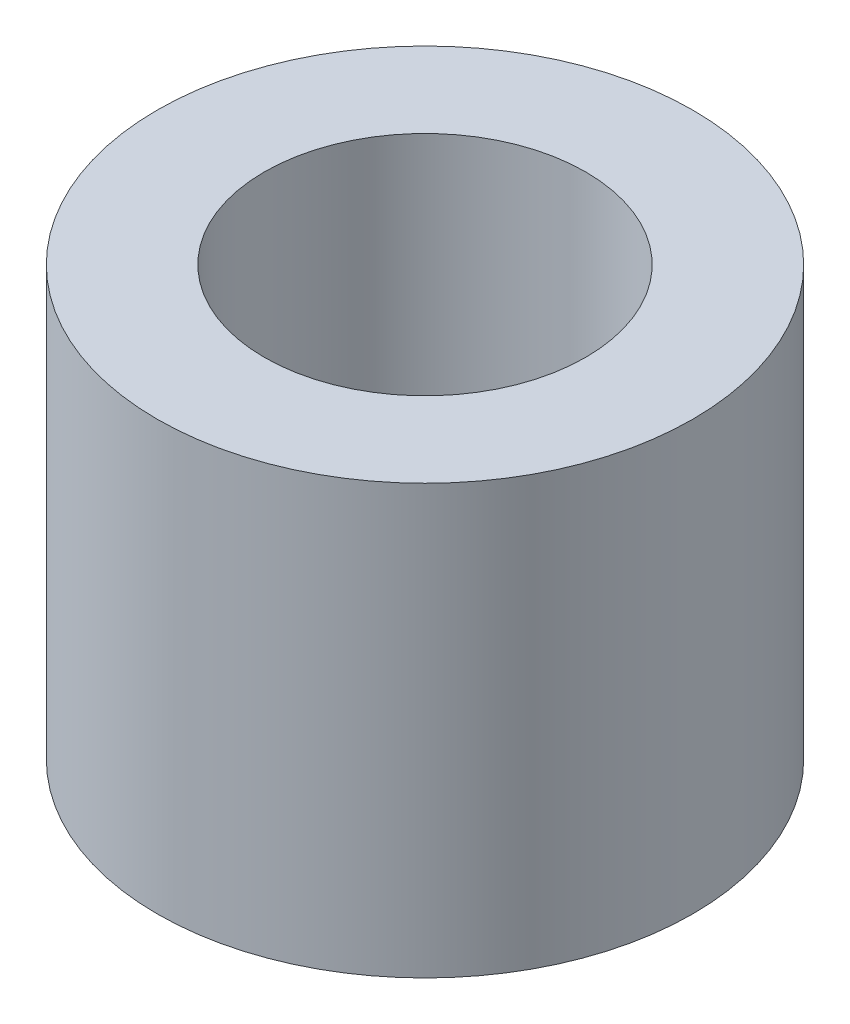
ISO-10303-21;
HEADER;
FILE_DESCRIPTION(('STEP AP214'),'2;1');
FILE_NAME('part.step','',(''),(''),'','','');
FILE_SCHEMA(('AUTOMOTIVE_DESIGN { 1 0 10303 214 1 1 1 1 }'));
ENDSEC;
DATA;
#1=APPLICATION_CONTEXT('core data for automotive mechanical design processes');
#2=APPLICATION_PROTOCOL_DEFINITION('international standard','automotive_design',2000,#1);
#3=PRODUCT_CONTEXT('',#1,'mechanical');
#4=PRODUCT('Part','Part','',(#3));
#5=PRODUCT_RELATED_PRODUCT_CATEGORY('part','',(#4));
#6=PRODUCT_DEFINITION_FORMATION('','',#4);
#7=PRODUCT_DEFINITION_CONTEXT('part definition',#1,'design');
#8=PRODUCT_DEFINITION('design','',#6,#7);
#9=PRODUCT_DEFINITION_SHAPE('','',#8);
#10=(LENGTH_UNIT() NAMED_UNIT(*) SI_UNIT(.MILLI.,.METRE.));
#11=(NAMED_UNIT(*) PLANE_ANGLE_UNIT() SI_UNIT($,.RADIAN.));
#12=(NAMED_UNIT(*) SI_UNIT($,.STERADIAN.) SOLID_ANGLE_UNIT());
#13=UNCERTAINTY_MEASURE_WITH_UNIT(LENGTH_MEASURE(1.E-05),#10,'distance_accuracy_value','');
#14=(GEOMETRIC_REPRESENTATION_CONTEXT(3) GLOBAL_UNCERTAINTY_ASSIGNED_CONTEXT((#13)) GLOBAL_UNIT_ASSIGNED_CONTEXT((#10,
#11,#12)) REPRESENTATION_CONTEXT('',''));
#15=CARTESIAN_POINT('',(0.,0.,0.));
#16=DIRECTION('',(0.,0.,1.));
#17=DIRECTION('',(1.,0.,0.));
#18=AXIS2_PLACEMENT_3D('',#15,#16,#17);
#19=CARTESIAN_POINT('',(0.,4.,0.));
#20=DIRECTION('',(0.,1.,0.));
#21=DIRECTION('',(0.,0.,1.));
#22=AXIS2_PLACEMENT_3D('',#19,#20,#21);
#23=PLANE('',#22);
#24=CARTESIAN_POINT('',(0.,4.,0.));
#25=DIRECTION('',(0.,1.,0.));
#26=DIRECTION('',(0.,0.,1.));
#27=AXIS2_PLACEMENT_3D('',#24,#25,#26);
#28=CIRCLE('',#27,2.5);
#29=CARTESIAN_POINT('',(0.,4.,2.5));
#30=VERTEX_POINT('',#29);
#31=EDGE_CURVE('E10',#30,#30,#28,.T.);
#32=ORIENTED_EDGE('',*,*,#31,.T.);
#33=EDGE_LOOP('',(#32));
#34=FACE_BOUND('',#33,.T.);
#35=CARTESIAN_POINT('',(0.,4.,0.));
#36=DIRECTION('',(0.,1.,0.));
#37=DIRECTION('',(0.,0.,1.));
#38=AXIS2_PLACEMENT_3D('',#35,#36,#37);
#39=CIRCLE('',#38,1.5);
#40=CARTESIAN_POINT('',(0.,4.,1.5));
#41=VERTEX_POINT('',#40);
#42=EDGE_CURVE('E43',#41,#41,#39,.T.);
#43=ORIENTED_EDGE('',*,*,#42,.F.);
#44=EDGE_LOOP('',(#43));
#45=FACE_BOUND('',#44,.T.);
#46=ADVANCED_FACE('F32',(#34,#45),#23,.T.);
#47=CARTESIAN_POINT('',(0.,0.,0.));
#48=DIRECTION('',(0.,1.,0.));
#49=DIRECTION('',(0.,0.,1.));
#50=AXIS2_PLACEMENT_3D('',#47,#48,#49);
#51=PLANE('',#50);
#52=CARTESIAN_POINT('',(0.,0.,0.));
#53=DIRECTION('',(0.,1.,0.));
#54=DIRECTION('',(0.,0.,1.));
#55=AXIS2_PLACEMENT_3D('',#52,#53,#54);
#56=CIRCLE('',#55,2.5);
#57=CARTESIAN_POINT('',(0.,0.,2.5));
#58=VERTEX_POINT('',#57);
#59=EDGE_CURVE('E36',#58,#58,#56,.T.);
#60=ORIENTED_EDGE('',*,*,#59,.F.);
#61=EDGE_LOOP('',(#60));
#62=FACE_BOUND('',#61,.T.);
#63=CARTESIAN_POINT('',(0.,0.,0.));
#64=DIRECTION('',(0.,1.,0.));
#65=DIRECTION('',(0.,0.,1.));
#66=AXIS2_PLACEMENT_3D('',#63,#64,#65);
#67=CIRCLE('',#66,1.5);
#68=CARTESIAN_POINT('',(0.,0.,1.5));
#69=VERTEX_POINT('',#68);
#70=EDGE_CURVE('E45',#69,#69,#67,.T.);
#71=ORIENTED_EDGE('',*,*,#70,.T.);
#72=EDGE_LOOP('',(#71));
#73=FACE_BOUND('',#72,.T.);
#74=ADVANCED_FACE('F55',(#62,#73),#51,.F.);
#75=CARTESIAN_POINT('',(0.,4.,0.));
#76=DIRECTION('',(0.,-1.,0.));
#77=DIRECTION('',(0.,0.,-1.));
#78=AXIS2_PLACEMENT_3D('',#75,#76,#77);
#79=CYLINDRICAL_SURFACE('',#78,2.5);
#80=ORIENTED_EDGE('',*,*,#31,.F.);
#81=EDGE_LOOP('',(#80));
#82=FACE_BOUND('',#81,.T.);
#83=ORIENTED_EDGE('',*,*,#59,.T.);
#84=EDGE_LOOP('',(#83));
#85=FACE_BOUND('',#84,.T.);
#86=ADVANCED_FACE('F34',(#82,#85),#79,.T.);
#87=CARTESIAN_POINT('',(0.,4.,0.));
#88=DIRECTION('',(0.,-1.,0.));
#89=DIRECTION('',(0.,0.,-1.));
#90=AXIS2_PLACEMENT_3D('',#87,#88,#89);
#91=CYLINDRICAL_SURFACE('',#90,1.5);
#92=ORIENTED_EDGE('',*,*,#42,.T.);
#93=EDGE_LOOP('',(#92));
#94=FACE_BOUND('',#93,.T.);
#95=ORIENTED_EDGE('',*,*,#70,.F.);
#96=EDGE_LOOP('',(#95));
#97=FACE_BOUND('',#96,.T.);
#98=ADVANCED_FACE('F51',(#94,#97),#91,.F.);
#99=CLOSED_SHELL('',(#46,#74,#86,#98));
#100=MANIFOLD_SOLID_BREP('B2',#99);
#101=ADVANCED_BREP_SHAPE_REPRESENTATION('',(#18,#100),#14);
#102=SHAPE_DEFINITION_REPRESENTATION(#9,#101);
ENDSEC;
END-ISO-10303-21;
